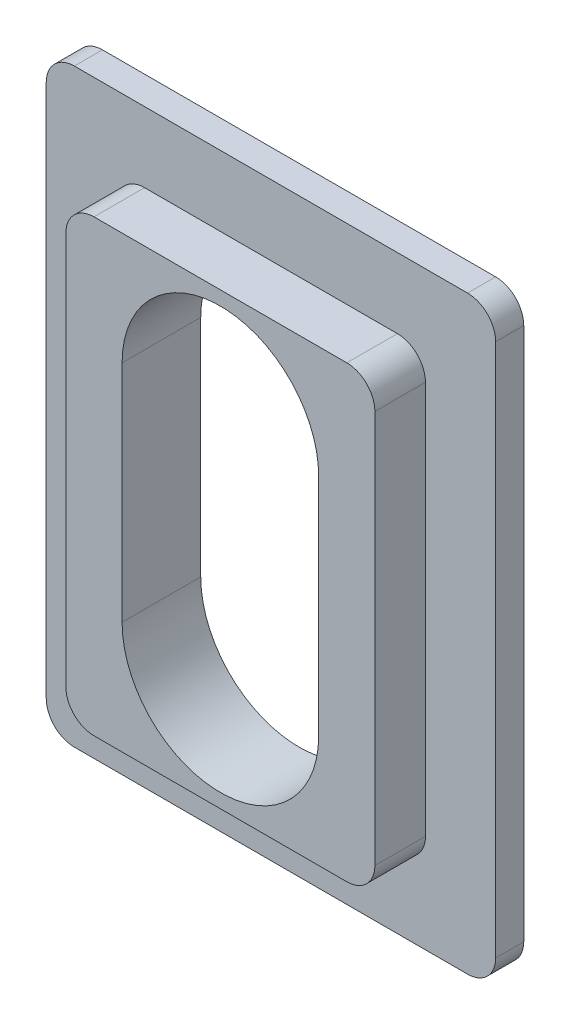
ISO-10303-21;
HEADER;
FILE_DESCRIPTION(('STEP AP214'),'2;1');
FILE_NAME('part.step','',(''),(''),'','','');
FILE_SCHEMA(('AUTOMOTIVE_DESIGN { 1 0 10303 214 1 1 1 1 }'));
ENDSEC;
DATA;
#1=APPLICATION_CONTEXT('core data for automotive mechanical design processes');
#2=APPLICATION_PROTOCOL_DEFINITION('international standard','automotive_design',2000,#1);
#3=PRODUCT_CONTEXT('',#1,'mechanical');
#4=PRODUCT('Part','Part','',(#3));
#5=PRODUCT_RELATED_PRODUCT_CATEGORY('part','',(#4));
#6=PRODUCT_DEFINITION_FORMATION('','',#4);
#7=PRODUCT_DEFINITION_CONTEXT('part definition',#1,'design');
#8=PRODUCT_DEFINITION('design','',#6,#7);
#9=PRODUCT_DEFINITION_SHAPE('','',#8);
#10=(LENGTH_UNIT() NAMED_UNIT(*) SI_UNIT(.MILLI.,.METRE.));
#11=(NAMED_UNIT(*) PLANE_ANGLE_UNIT() SI_UNIT($,.RADIAN.));
#12=(NAMED_UNIT(*) SI_UNIT($,.STERADIAN.) SOLID_ANGLE_UNIT());
#13=UNCERTAINTY_MEASURE_WITH_UNIT(LENGTH_MEASURE(1.E-05),#10,'distance_accuracy_value','');
#14=(GEOMETRIC_REPRESENTATION_CONTEXT(3) GLOBAL_UNCERTAINTY_ASSIGNED_CONTEXT((#13)) GLOBAL_UNIT_ASSIGNED_CONTEXT((#10,
#11,#12)) REPRESENTATION_CONTEXT('',''));
#15=CARTESIAN_POINT('',(0.,0.,0.));
#16=DIRECTION('',(0.,0.,1.));
#17=DIRECTION('',(1.,0.,0.));
#18=AXIS2_PLACEMENT_3D('',#15,#16,#17);
#19=CARTESIAN_POINT('',(1.,1.,1.));
#20=DIRECTION('',(0.,0.,-1.));
#21=DIRECTION('',(-1.,0.,0.));
#22=AXIS2_PLACEMENT_3D('',#19,#20,#21);
#23=CYLINDRICAL_SURFACE('',#22,1.);
#24=CARTESIAN_POINT('',(1.,1.,0.));
#25=DIRECTION('',(0.,0.,1.));
#26=DIRECTION('',(1.,0.,0.));
#27=AXIS2_PLACEMENT_3D('',#24,#25,#26);
#28=CIRCLE('',#27,1.);
#29=CARTESIAN_POINT('',(1.00000000000001,0.,0.));
#30=VERTEX_POINT('',#29);
#31=CARTESIAN_POINT('',(0.,1.00000000000001,0.));
#32=VERTEX_POINT('',#31);
#33=EDGE_CURVE('E297',#30,#32,#28,.F.);
#34=ORIENTED_EDGE('',*,*,#33,.F.);
#35=DIRECTION('',(0.,0.,-1.));
#36=VECTOR('',#35,1.);
#37=CARTESIAN_POINT('',(1.00000000000001,0.,1.));
#38=LINE('',#37,#36);
#39=CARTESIAN_POINT('',(1.00000000000001,0.,1.));
#40=VERTEX_POINT('',#39);
#41=EDGE_CURVE('E11',#40,#30,#38,.T.);
#42=ORIENTED_EDGE('',*,*,#41,.F.);
#43=CARTESIAN_POINT('',(1.,1.,1.));
#44=DIRECTION('',(0.,0.,1.));
#45=DIRECTION('',(1.,0.,0.));
#46=AXIS2_PLACEMENT_3D('',#43,#44,#45);
#47=CIRCLE('',#46,1.);
#48=CARTESIAN_POINT('',(0.,1.00000000000001,1.));
#49=VERTEX_POINT('',#48);
#50=EDGE_CURVE('E263',#40,#49,#47,.F.);
#51=ORIENTED_EDGE('',*,*,#50,.T.);
#52=DIRECTION('',(0.,0.,-1.));
#53=VECTOR('',#52,1.);
#54=CARTESIAN_POINT('',(0.,1.00000000000001,1.));
#55=LINE('',#54,#53);
#56=EDGE_CURVE('E179',#49,#32,#55,.T.);
#57=ORIENTED_EDGE('',*,*,#56,.T.);
#58=EDGE_LOOP('',(#34,#42,#51,#57));
#59=FACE_BOUND('',#58,.T.);
#60=ADVANCED_FACE('F35',(#59),#23,.T.);
#61=CARTESIAN_POINT('',(0.,0.,1.));
#62=DIRECTION('',(0.,1.,0.));
#63=DIRECTION('',(0.,0.,1.));
#64=AXIS2_PLACEMENT_3D('',#61,#62,#63);
#65=PLANE('',#64);
#66=DIRECTION('',(1.,0.,0.));
#67=VECTOR('',#66,1.);
#68=CARTESIAN_POINT('',(0.,0.,0.));
#69=LINE('',#68,#67);
#70=CARTESIAN_POINT('',(15.,0.,0.));
#71=VERTEX_POINT('',#70);
#72=EDGE_CURVE('E300',#30,#71,#69,.T.);
#73=ORIENTED_EDGE('',*,*,#72,.T.);
#74=DIRECTION('',(0.,0.,-1.));
#75=VECTOR('',#74,1.);
#76=CARTESIAN_POINT('',(15.,0.,1.));
#77=LINE('',#76,#75);
#78=CARTESIAN_POINT('',(15.,0.,1.));
#79=VERTEX_POINT('',#78);
#80=EDGE_CURVE('E44',#79,#71,#77,.T.);
#81=ORIENTED_EDGE('',*,*,#80,.F.);
#82=DIRECTION('',(1.,0.,0.));
#83=VECTOR('',#82,1.);
#84=CARTESIAN_POINT('',(0.,0.,1.));
#85=LINE('',#84,#83);
#86=EDGE_CURVE('E266',#40,#79,#85,.T.);
#87=ORIENTED_EDGE('',*,*,#86,.F.);
#88=ORIENTED_EDGE('',*,*,#41,.T.);
#89=EDGE_LOOP('',(#73,#81,#87,#88));
#90=FACE_BOUND('',#89,.T.);
#91=ADVANCED_FACE('F357',(#90),#65,.F.);
#92=CARTESIAN_POINT('',(15.,1.,1.));
#93=DIRECTION('',(0.,0.,-1.));
#94=DIRECTION('',(-1.,0.,0.));
#95=AXIS2_PLACEMENT_3D('',#92,#93,#94);
#96=CYLINDRICAL_SURFACE('',#95,1.);
#97=CARTESIAN_POINT('',(15.,1.,0.));
#98=DIRECTION('',(0.,0.,1.));
#99=DIRECTION('',(1.,0.,0.));
#100=AXIS2_PLACEMENT_3D('',#97,#98,#99);
#101=CIRCLE('',#100,1.);
#102=CARTESIAN_POINT('',(16.,1.,0.));
#103=VERTEX_POINT('',#102);
#104=EDGE_CURVE('E303',#71,#103,#101,.T.);
#105=ORIENTED_EDGE('',*,*,#104,.T.);
#106=DIRECTION('',(0.,0.,-1.));
#107=VECTOR('',#106,1.);
#108=CARTESIAN_POINT('',(16.,1.,1.));
#109=LINE('',#108,#107);
#110=CARTESIAN_POINT('',(16.,1.,1.));
#111=VERTEX_POINT('',#110);
#112=EDGE_CURVE('E329',#111,#103,#109,.T.);
#113=ORIENTED_EDGE('',*,*,#112,.F.);
#114=CARTESIAN_POINT('',(15.,1.,1.));
#115=DIRECTION('',(0.,0.,1.));
#116=DIRECTION('',(1.,0.,0.));
#117=AXIS2_PLACEMENT_3D('',#114,#115,#116);
#118=CIRCLE('',#117,1.);
#119=EDGE_CURVE('E270',#79,#111,#118,.T.);
#120=ORIENTED_EDGE('',*,*,#119,.F.);
#121=ORIENTED_EDGE('',*,*,#80,.T.);
#122=EDGE_LOOP('',(#105,#113,#120,#121));
#123=FACE_BOUND('',#122,.T.);
#124=ADVANCED_FACE('F362',(#123),#96,.T.);
#125=CARTESIAN_POINT('',(16.,0.,1.));
#126=DIRECTION('',(-1.,0.,0.));
#127=DIRECTION('',(0.,0.,1.));
#128=AXIS2_PLACEMENT_3D('',#125,#126,#127);
#129=PLANE('',#128);
#130=DIRECTION('',(0.,1.,0.));
#131=VECTOR('',#130,1.);
#132=CARTESIAN_POINT('',(16.,0.,0.));
#133=LINE('',#132,#131);
#134=CARTESIAN_POINT('',(16.,20.,0.));
#135=VERTEX_POINT('',#134);
#136=EDGE_CURVE('E306',#103,#135,#133,.T.);
#137=ORIENTED_EDGE('',*,*,#136,.T.);
#138=DIRECTION('',(0.,0.,-1.));
#139=VECTOR('',#138,1.);
#140=CARTESIAN_POINT('',(16.,20.,1.));
#141=LINE('',#140,#139);
#142=CARTESIAN_POINT('',(16.,20.,1.));
#143=VERTEX_POINT('',#142);
#144=EDGE_CURVE('E327',#143,#135,#141,.T.);
#145=ORIENTED_EDGE('',*,*,#144,.F.);
#146=DIRECTION('',(0.,1.,0.));
#147=VECTOR('',#146,1.);
#148=CARTESIAN_POINT('',(16.,0.,1.));
#149=LINE('',#148,#147);
#150=EDGE_CURVE('E273',#111,#143,#149,.T.);
#151=ORIENTED_EDGE('',*,*,#150,.F.);
#152=ORIENTED_EDGE('',*,*,#112,.T.);
#153=EDGE_LOOP('',(#137,#145,#151,#152));
#154=FACE_BOUND('',#153,.T.);
#155=ADVANCED_FACE('F369',(#154),#129,.F.);
#156=CARTESIAN_POINT('',(15.,20.,1.));
#157=DIRECTION('',(0.,0.,-1.));
#158=DIRECTION('',(-1.,0.,0.));
#159=AXIS2_PLACEMENT_3D('',#156,#157,#158);
#160=CYLINDRICAL_SURFACE('',#159,1.);
#161=CARTESIAN_POINT('',(15.,20.,0.));
#162=DIRECTION('',(0.,0.,1.));
#163=DIRECTION('',(1.,0.,0.));
#164=AXIS2_PLACEMENT_3D('',#161,#162,#163);
#165=CIRCLE('',#164,1.);
#166=CARTESIAN_POINT('',(15.,21.,0.));
#167=VERTEX_POINT('',#166);
#168=EDGE_CURVE('E309',#167,#135,#165,.F.);
#169=ORIENTED_EDGE('',*,*,#168,.F.);
#170=DIRECTION('',(0.,0.,-1.));
#171=VECTOR('',#170,1.);
#172=CARTESIAN_POINT('',(15.,21.,1.));
#173=LINE('',#172,#171);
#174=CARTESIAN_POINT('',(15.,21.,1.));
#175=VERTEX_POINT('',#174);
#176=EDGE_CURVE('E325',#175,#167,#173,.T.);
#177=ORIENTED_EDGE('',*,*,#176,.F.);
#178=CARTESIAN_POINT('',(15.,20.,1.));
#179=DIRECTION('',(0.,0.,1.));
#180=DIRECTION('',(1.,0.,0.));
#181=AXIS2_PLACEMENT_3D('',#178,#179,#180);
#182=CIRCLE('',#181,1.);
#183=EDGE_CURVE('E275',#175,#143,#182,.F.);
#184=ORIENTED_EDGE('',*,*,#183,.T.);
#185=ORIENTED_EDGE('',*,*,#144,.T.);
#186=EDGE_LOOP('',(#169,#177,#184,#185));
#187=FACE_BOUND('',#186,.T.);
#188=ADVANCED_FACE('F373',(#187),#160,.T.);
#189=CARTESIAN_POINT('',(0.,21.,1.));
#190=DIRECTION('',(0.,1.,0.));
#191=DIRECTION('',(0.,0.,1.));
#192=AXIS2_PLACEMENT_3D('',#189,#190,#191);
#193=PLANE('',#192);
#194=DIRECTION('',(1.,0.,0.));
#195=VECTOR('',#194,1.);
#196=CARTESIAN_POINT('',(0.,21.,0.));
#197=LINE('',#196,#195);
#198=CARTESIAN_POINT('',(1.,21.,0.));
#199=VERTEX_POINT('',#198);
#200=EDGE_CURVE('E312',#199,#167,#197,.T.);
#201=ORIENTED_EDGE('',*,*,#200,.F.);
#202=DIRECTION('',(0.,0.,-1.));
#203=VECTOR('',#202,1.);
#204=CARTESIAN_POINT('',(1.,21.,1.));
#205=LINE('',#204,#203);
#206=CARTESIAN_POINT('',(1.,21.,1.));
#207=VERTEX_POINT('',#206);
#208=EDGE_CURVE('E323',#207,#199,#205,.T.);
#209=ORIENTED_EDGE('',*,*,#208,.F.);
#210=DIRECTION('',(1.,0.,0.));
#211=VECTOR('',#210,1.);
#212=CARTESIAN_POINT('',(0.,21.,1.));
#213=LINE('',#212,#211);
#214=EDGE_CURVE('E278',#207,#175,#213,.T.);
#215=ORIENTED_EDGE('',*,*,#214,.T.);
#216=ORIENTED_EDGE('',*,*,#176,.T.);
#217=EDGE_LOOP('',(#201,#209,#215,#216));
#218=FACE_BOUND('',#217,.T.);
#219=ADVANCED_FACE('F377',(#218),#193,.T.);
#220=CARTESIAN_POINT('',(1.,20.,1.));
#221=DIRECTION('',(0.,0.,-1.));
#222=DIRECTION('',(-1.,0.,0.));
#223=AXIS2_PLACEMENT_3D('',#220,#221,#222);
#224=CYLINDRICAL_SURFACE('',#223,1.);
#225=CARTESIAN_POINT('',(1.,20.,0.));
#226=DIRECTION('',(0.,0.,1.));
#227=DIRECTION('',(1.,0.,0.));
#228=AXIS2_PLACEMENT_3D('',#225,#226,#227);
#229=CIRCLE('',#228,1.);
#230=CARTESIAN_POINT('',(0.,20.,0.));
#231=VERTEX_POINT('',#230);
#232=EDGE_CURVE('E315',#231,#199,#229,.F.);
#233=ORIENTED_EDGE('',*,*,#232,.F.);
#234=DIRECTION('',(0.,0.,-1.));
#235=VECTOR('',#234,1.);
#236=CARTESIAN_POINT('',(0.,20.,1.));
#237=LINE('',#236,#235);
#238=CARTESIAN_POINT('',(0.,20.,1.));
#239=VERTEX_POINT('',#238);
#240=EDGE_CURVE('E321',#239,#231,#237,.T.);
#241=ORIENTED_EDGE('',*,*,#240,.F.);
#242=CARTESIAN_POINT('',(1.,20.,1.));
#243=DIRECTION('',(0.,0.,1.));
#244=DIRECTION('',(1.,0.,0.));
#245=AXIS2_PLACEMENT_3D('',#242,#243,#244);
#246=CIRCLE('',#245,1.);
#247=EDGE_CURVE('E281',#239,#207,#246,.F.);
#248=ORIENTED_EDGE('',*,*,#247,.T.);
#249=ORIENTED_EDGE('',*,*,#208,.T.);
#250=EDGE_LOOP('',(#233,#241,#248,#249));
#251=FACE_BOUND('',#250,.T.);
#252=ADVANCED_FACE('F381',(#251),#224,.T.);
#253=CARTESIAN_POINT('',(8.,14.5,1.));
#254=DIRECTION('',(0.,0.,-1.));
#255=DIRECTION('',(-1.,0.,0.));
#256=AXIS2_PLACEMENT_3D('',#253,#254,#255);
#257=CYLINDRICAL_SURFACE('',#256,3.5);
#258=CARTESIAN_POINT('',(8.,14.5,0.));
#259=DIRECTION('',(0.,0.,1.));
#260=DIRECTION('',(1.,0.,0.));
#261=AXIS2_PLACEMENT_3D('',#258,#259,#260);
#262=CIRCLE('',#261,3.5);
#263=CARTESIAN_POINT('',(11.5,14.5,0.));
#264=VERTEX_POINT('',#263);
#265=CARTESIAN_POINT('',(4.5,14.5,0.));
#266=VERTEX_POINT('',#265);
#267=EDGE_CURVE('E174',#264,#266,#262,.T.);
#268=ORIENTED_EDGE('',*,*,#267,.F.);
#269=DIRECTION('',(0.,0.,-1.));
#270=VECTOR('',#269,1.);
#271=CARTESIAN_POINT('',(11.5,14.5,1.));
#272=LINE('',#271,#270);
#273=CARTESIAN_POINT('',(11.5,14.5,2.8));
#274=VERTEX_POINT('',#273);
#275=EDGE_CURVE('E39',#274,#264,#272,.T.);
#276=ORIENTED_EDGE('',*,*,#275,.F.);
#277=CARTESIAN_POINT('',(8.,14.5,2.8));
#278=DIRECTION('',(0.,0.,1.));
#279=DIRECTION('',(1.,0.,0.));
#280=AXIS2_PLACEMENT_3D('',#277,#278,#279);
#281=CIRCLE('',#280,3.5);
#282=CARTESIAN_POINT('',(4.5,14.5,2.8));
#283=VERTEX_POINT('',#282);
#284=EDGE_CURVE('E172',#274,#283,#281,.T.);
#285=ORIENTED_EDGE('',*,*,#284,.T.);
#286=DIRECTION('',(0.,0.,-1.));
#287=VECTOR('',#286,1.);
#288=CARTESIAN_POINT('',(4.5,14.5,1.));
#289=LINE('',#288,#287);
#290=EDGE_CURVE('E287',#283,#266,#289,.T.);
#291=ORIENTED_EDGE('',*,*,#290,.T.);
#292=EDGE_LOOP('',(#268,#276,#285,#291));
#293=FACE_BOUND('',#292,.T.);
#294=ADVANCED_FACE('F37',(#293),#257,.F.);
#295=CARTESIAN_POINT('',(11.5,0.,1.));
#296=DIRECTION('',(-1.,0.,0.));
#297=DIRECTION('',(0.,-1.,0.));
#298=AXIS2_PLACEMENT_3D('',#295,#296,#297);
#299=PLANE('',#298);
#300=DIRECTION('',(0.,1.,0.));
#301=VECTOR('',#300,1.);
#302=CARTESIAN_POINT('',(11.5,0.,0.));
#303=LINE('',#302,#301);
#304=CARTESIAN_POINT('',(11.5,6.5,0.));
#305=VERTEX_POINT('',#304);
#306=EDGE_CURVE('E289',#305,#264,#303,.T.);
#307=ORIENTED_EDGE('',*,*,#306,.F.);
#308=DIRECTION('',(0.,0.,-1.));
#309=VECTOR('',#308,1.);
#310=CARTESIAN_POINT('',(11.5,6.5,1.));
#311=LINE('',#310,#309);
#312=CARTESIAN_POINT('',(11.5,6.5,2.8));
#313=VERTEX_POINT('',#312);
#314=EDGE_CURVE('E180',#313,#305,#311,.T.);
#315=ORIENTED_EDGE('',*,*,#314,.F.);
#316=DIRECTION('',(0.,1.,0.));
#317=VECTOR('',#316,1.);
#318=CARTESIAN_POINT('',(11.5,0.,2.8));
#319=LINE('',#318,#317);
#320=EDGE_CURVE('E187',#313,#274,#319,.T.);
#321=ORIENTED_EDGE('',*,*,#320,.T.);
#322=ORIENTED_EDGE('',*,*,#275,.T.);
#323=EDGE_LOOP('',(#307,#315,#321,#322));
#324=FACE_BOUND('',#323,.T.);
#325=ADVANCED_FACE('F192',(#324),#299,.T.);
#326=CARTESIAN_POINT('',(8.,6.5,1.));
#327=DIRECTION('',(0.,0.,-1.));
#328=DIRECTION('',(-1.,0.,0.));
#329=AXIS2_PLACEMENT_3D('',#326,#327,#328);
#330=CYLINDRICAL_SURFACE('',#329,3.5);
#331=CARTESIAN_POINT('',(8.,6.5,0.));
#332=DIRECTION('',(0.,0.,1.));
#333=DIRECTION('',(1.,0.,0.));
#334=AXIS2_PLACEMENT_3D('',#331,#332,#333);
#335=CIRCLE('',#334,3.5);
#336=CARTESIAN_POINT('',(4.5,6.5,0.));
#337=VERTEX_POINT('',#336);
#338=EDGE_CURVE('E291',#337,#305,#335,.T.);
#339=ORIENTED_EDGE('',*,*,#338,.F.);
#340=DIRECTION('',(0.,0.,-1.));
#341=VECTOR('',#340,1.);
#342=CARTESIAN_POINT('',(4.5,6.5,1.));
#343=LINE('',#342,#341);
#344=CARTESIAN_POINT('',(4.5,6.5,2.8));
#345=VERTEX_POINT('',#344);
#346=EDGE_CURVE('E335',#345,#337,#343,.T.);
#347=ORIENTED_EDGE('',*,*,#346,.F.);
#348=CARTESIAN_POINT('',(8.,6.5,2.8));
#349=DIRECTION('',(0.,0.,1.));
#350=DIRECTION('',(1.,0.,0.));
#351=AXIS2_PLACEMENT_3D('',#348,#349,#350);
#352=CIRCLE('',#351,3.5);
#353=EDGE_CURVE('E193',#345,#313,#352,.T.);
#354=ORIENTED_EDGE('',*,*,#353,.T.);
#355=ORIENTED_EDGE('',*,*,#314,.T.);
#356=EDGE_LOOP('',(#339,#347,#354,#355));
#357=FACE_BOUND('',#356,.T.);
#358=ADVANCED_FACE('F338',(#357),#330,.F.);
#359=CARTESIAN_POINT('',(4.5,0.,1.));
#360=DIRECTION('',(-1.,0.,0.));
#361=DIRECTION('',(0.,-1.,0.));
#362=AXIS2_PLACEMENT_3D('',#359,#360,#361);
#363=PLANE('',#362);
#364=DIRECTION('',(0.,1.,0.));
#365=VECTOR('',#364,1.);
#366=CARTESIAN_POINT('',(4.5,0.,0.));
#367=LINE('',#366,#365);
#368=EDGE_CURVE('E294',#337,#266,#367,.T.);
#369=ORIENTED_EDGE('',*,*,#368,.T.);
#370=ORIENTED_EDGE('',*,*,#290,.F.);
#371=DIRECTION('',(0.,1.,0.));
#372=VECTOR('',#371,1.);
#373=CARTESIAN_POINT('',(4.5,0.,2.8));
#374=LINE('',#373,#372);
#375=EDGE_CURVE('E190',#345,#283,#374,.T.);
#376=ORIENTED_EDGE('',*,*,#375,.F.);
#377=ORIENTED_EDGE('',*,*,#346,.T.);
#378=EDGE_LOOP('',(#369,#370,#376,#377));
#379=FACE_BOUND('',#378,.T.);
#380=ADVANCED_FACE('F343',(#379),#363,.F.);
#381=CARTESIAN_POINT('',(0.,0.,1.));
#382=DIRECTION('',(-1.,0.,0.));
#383=DIRECTION('',(0.,0.,1.));
#384=AXIS2_PLACEMENT_3D('',#381,#382,#383);
#385=PLANE('',#384);
#386=DIRECTION('',(0.,1.,0.));
#387=VECTOR('',#386,1.);
#388=CARTESIAN_POINT('',(0.,0.,0.));
#389=LINE('',#388,#387);
#390=EDGE_CURVE('E267',#32,#231,#389,.T.);
#391=ORIENTED_EDGE('',*,*,#390,.F.);
#392=ORIENTED_EDGE('',*,*,#56,.F.);
#393=DIRECTION('',(0.,1.,0.));
#394=VECTOR('',#393,1.);
#395=CARTESIAN_POINT('',(0.,0.,1.));
#396=LINE('',#395,#394);
#397=EDGE_CURVE('E284',#49,#239,#396,.T.);
#398=ORIENTED_EDGE('',*,*,#397,.T.);
#399=ORIENTED_EDGE('',*,*,#240,.T.);
#400=EDGE_LOOP('',(#391,#392,#398,#399));
#401=FACE_BOUND('',#400,.T.);
#402=ADVANCED_FACE('F345',(#401),#385,.T.);
#403=CARTESIAN_POINT('',(0.,0.,1.));
#404=DIRECTION('',(0.,0.,1.));
#405=DIRECTION('',(1.,0.,0.));
#406=AXIS2_PLACEMENT_3D('',#403,#404,#405);
#407=PLANE('',#406);
#408=CARTESIAN_POINT('',(3.5,3.5,1.));
#409=DIRECTION('',(0.,0.,1.));
#410=DIRECTION('',(1.,0.,0.));
#411=AXIS2_PLACEMENT_3D('',#408,#409,#410);
#412=CIRCLE('',#411,1.);
#413=CARTESIAN_POINT('',(2.5,3.50000000000001,1.));
#414=VERTEX_POINT('',#413);
#415=CARTESIAN_POINT('',(3.50000000000001,2.5,1.));
#416=VERTEX_POINT('',#415);
#417=EDGE_CURVE('E261',#414,#416,#412,.T.);
#418=ORIENTED_EDGE('',*,*,#417,.F.);
#419=DIRECTION('',(0.,-1.,0.));
#420=VECTOR('',#419,1.);
#421=CARTESIAN_POINT('',(2.5,0.,1.));
#422=LINE('',#421,#420);
#423=CARTESIAN_POINT('',(2.5,17.5,1.));
#424=VERTEX_POINT('',#423);
#425=EDGE_CURVE('E245',#424,#414,#422,.T.);
#426=ORIENTED_EDGE('',*,*,#425,.F.);
#427=CARTESIAN_POINT('',(3.5,17.5,1.));
#428=DIRECTION('',(0.,0.,1.));
#429=DIRECTION('',(1.,0.,0.));
#430=AXIS2_PLACEMENT_3D('',#427,#428,#429);
#431=CIRCLE('',#430,0.999999999999999);
#432=CARTESIAN_POINT('',(3.5,18.5,1.));
#433=VERTEX_POINT('',#432);
#434=EDGE_CURVE('E248',#433,#424,#431,.T.);
#435=ORIENTED_EDGE('',*,*,#434,.F.);
#436=DIRECTION('',(-1.,0.,0.));
#437=VECTOR('',#436,1.);
#438=CARTESIAN_POINT('',(0.,18.5,1.));
#439=LINE('',#438,#437);
#440=CARTESIAN_POINT('',(12.5,18.5,1.));
#441=VERTEX_POINT('',#440);
#442=EDGE_CURVE('E251',#441,#433,#439,.T.);
#443=ORIENTED_EDGE('',*,*,#442,.F.);
#444=CARTESIAN_POINT('',(12.5,17.5,1.));
#445=DIRECTION('',(0.,0.,1.));
#446=DIRECTION('',(1.,0.,0.));
#447=AXIS2_PLACEMENT_3D('',#444,#445,#446);
#448=CIRCLE('',#447,0.999999999999999);
#449=CARTESIAN_POINT('',(13.5,17.5,1.));
#450=VERTEX_POINT('',#449);
#451=EDGE_CURVE('E254',#450,#441,#448,.T.);
#452=ORIENTED_EDGE('',*,*,#451,.F.);
#453=DIRECTION('',(0.,-1.,0.));
#454=VECTOR('',#453,1.);
#455=CARTESIAN_POINT('',(13.5,0.,1.));
#456=LINE('',#455,#454);
#457=CARTESIAN_POINT('',(13.5,3.5,1.));
#458=VERTEX_POINT('',#457);
#459=EDGE_CURVE('E257',#450,#458,#456,.T.);
#460=ORIENTED_EDGE('',*,*,#459,.T.);
#461=CARTESIAN_POINT('',(12.5,3.5,1.));
#462=DIRECTION('',(0.,0.,1.));
#463=DIRECTION('',(1.,0.,0.));
#464=AXIS2_PLACEMENT_3D('',#461,#462,#463);
#465=CIRCLE('',#464,1.);
#466=CARTESIAN_POINT('',(12.5,2.5,1.));
#467=VERTEX_POINT('',#466);
#468=EDGE_CURVE('E57',#458,#467,#465,.F.);
#469=ORIENTED_EDGE('',*,*,#468,.T.);
#470=DIRECTION('',(-1.,0.,0.));
#471=VECTOR('',#470,1.);
#472=CARTESIAN_POINT('',(0.,2.5,1.));
#473=LINE('',#472,#471);
#474=EDGE_CURVE('E52',#467,#416,#473,.T.);
#475=ORIENTED_EDGE('',*,*,#474,.T.);
#476=EDGE_LOOP('',(#418,#426,#435,#443,#452,#460,#469,#475));
#477=FACE_BOUND('',#476,.T.);
#478=ORIENTED_EDGE('',*,*,#50,.F.);
#479=ORIENTED_EDGE('',*,*,#86,.T.);
#480=ORIENTED_EDGE('',*,*,#119,.T.);
#481=ORIENTED_EDGE('',*,*,#150,.T.);
#482=ORIENTED_EDGE('',*,*,#183,.F.);
#483=ORIENTED_EDGE('',*,*,#214,.F.);
#484=ORIENTED_EDGE('',*,*,#247,.F.);
#485=ORIENTED_EDGE('',*,*,#397,.F.);
#486=EDGE_LOOP('',(#478,#479,#480,#481,#482,#483,#484,#485));
#487=FACE_BOUND('',#486,.T.);
#488=ADVANCED_FACE('F351',(#477,#487),#407,.T.);
#489=CARTESIAN_POINT('',(0.,0.,0.));
#490=DIRECTION('',(0.,0.,1.));
#491=DIRECTION('',(1.,0.,0.));
#492=AXIS2_PLACEMENT_3D('',#489,#490,#491);
#493=PLANE('',#492);
#494=ORIENTED_EDGE('',*,*,#33,.T.);
#495=ORIENTED_EDGE('',*,*,#390,.T.);
#496=ORIENTED_EDGE('',*,*,#232,.T.);
#497=ORIENTED_EDGE('',*,*,#200,.T.);
#498=ORIENTED_EDGE('',*,*,#168,.T.);
#499=ORIENTED_EDGE('',*,*,#136,.F.);
#500=ORIENTED_EDGE('',*,*,#104,.F.);
#501=ORIENTED_EDGE('',*,*,#72,.F.);
#502=EDGE_LOOP('',(#494,#495,#496,#497,#498,#499,#500,#501));
#503=FACE_BOUND('',#502,.T.);
#504=ORIENTED_EDGE('',*,*,#267,.T.);
#505=ORIENTED_EDGE('',*,*,#368,.F.);
#506=ORIENTED_EDGE('',*,*,#338,.T.);
#507=ORIENTED_EDGE('',*,*,#306,.T.);
#508=EDGE_LOOP('',(#504,#505,#506,#507));
#509=FACE_BOUND('',#508,.T.);
#510=ADVANCED_FACE('F341',(#503,#509),#493,.F.);
#511=CARTESIAN_POINT('',(3.5,3.5,2.8));
#512=DIRECTION('',(0.,0.,-1.));
#513=DIRECTION('',(-1.,0.,0.));
#514=AXIS2_PLACEMENT_3D('',#511,#512,#513);
#515=CYLINDRICAL_SURFACE('',#514,1.);
#516=DIRECTION('',(0.,0.,-1.));
#517=VECTOR('',#516,1.);
#518=CARTESIAN_POINT('',(2.5,3.50000000000001,2.8));
#519=LINE('',#518,#517);
#520=CARTESIAN_POINT('',(2.5,3.50000000000001,2.8));
#521=VERTEX_POINT('',#520);
#522=EDGE_CURVE('E221',#521,#414,#519,.T.);
#523=ORIENTED_EDGE('',*,*,#522,.T.);
#524=ORIENTED_EDGE('',*,*,#417,.T.);
#525=DIRECTION('',(0.,0.,-1.));
#526=VECTOR('',#525,1.);
#527=CARTESIAN_POINT('',(3.50000000000001,2.5,2.8));
#528=LINE('',#527,#526);
#529=CARTESIAN_POINT('',(3.50000000000001,2.5,2.8));
#530=VERTEX_POINT('',#529);
#531=EDGE_CURVE('E242',#530,#416,#528,.T.);
#532=ORIENTED_EDGE('',*,*,#531,.F.);
#533=CARTESIAN_POINT('',(3.5,3.5,2.8));
#534=DIRECTION('',(0.,0.,1.));
#535=DIRECTION('',(1.,0.,0.));
#536=AXIS2_PLACEMENT_3D('',#533,#534,#535);
#537=CIRCLE('',#536,1.);
#538=EDGE_CURVE('E198',#530,#521,#537,.F.);
#539=ORIENTED_EDGE('',*,*,#538,.T.);
#540=EDGE_LOOP('',(#523,#524,#532,#539));
#541=FACE_BOUND('',#540,.T.);
#542=ADVANCED_FACE('F388',(#541),#515,.T.);
#543=CARTESIAN_POINT('',(0.,2.5,2.8));
#544=DIRECTION('',(0.,1.,0.));
#545=DIRECTION('',(0.,0.,1.));
#546=AXIS2_PLACEMENT_3D('',#543,#544,#545);
#547=PLANE('',#546);
#548=ORIENTED_EDGE('',*,*,#474,.F.);
#549=DIRECTION('',(0.,0.,-1.));
#550=VECTOR('',#549,1.);
#551=CARTESIAN_POINT('',(12.5,2.5,2.8));
#552=LINE('',#551,#550);
#553=CARTESIAN_POINT('',(12.5,2.5,2.8));
#554=VERTEX_POINT('',#553);
#555=EDGE_CURVE('E239',#554,#467,#552,.T.);
#556=ORIENTED_EDGE('',*,*,#555,.F.);
#557=DIRECTION('',(1.,0.,0.));
#558=VECTOR('',#557,1.);
#559=CARTESIAN_POINT('',(0.,2.5,2.8));
#560=LINE('',#559,#558);
#561=EDGE_CURVE('E201',#530,#554,#560,.T.);
#562=ORIENTED_EDGE('',*,*,#561,.F.);
#563=ORIENTED_EDGE('',*,*,#531,.T.);
#564=EDGE_LOOP('',(#548,#556,#562,#563));
#565=FACE_BOUND('',#564,.T.);
#566=ADVANCED_FACE('F394',(#565),#547,.F.);
#567=CARTESIAN_POINT('',(12.5,3.5,2.8));
#568=DIRECTION('',(0.,0.,-1.));
#569=DIRECTION('',(-1.,0.,0.));
#570=AXIS2_PLACEMENT_3D('',#567,#568,#569);
#571=CYLINDRICAL_SURFACE('',#570,1.);
#572=ORIENTED_EDGE('',*,*,#468,.F.);
#573=DIRECTION('',(0.,0.,-1.));
#574=VECTOR('',#573,1.);
#575=CARTESIAN_POINT('',(13.5,3.5,2.8));
#576=LINE('',#575,#574);
#577=CARTESIAN_POINT('',(13.5,3.5,2.8));
#578=VERTEX_POINT('',#577);
#579=EDGE_CURVE('E236',#578,#458,#576,.T.);
#580=ORIENTED_EDGE('',*,*,#579,.F.);
#581=CARTESIAN_POINT('',(12.5,3.5,2.8));
#582=DIRECTION('',(0.,0.,1.));
#583=DIRECTION('',(1.,0.,0.));
#584=AXIS2_PLACEMENT_3D('',#581,#582,#583);
#585=CIRCLE('',#584,1.);
#586=EDGE_CURVE('E204',#554,#578,#585,.T.);
#587=ORIENTED_EDGE('',*,*,#586,.F.);
#588=ORIENTED_EDGE('',*,*,#555,.T.);
#589=EDGE_LOOP('',(#572,#580,#587,#588));
#590=FACE_BOUND('',#589,.T.);
#591=ADVANCED_FACE('F398',(#590),#571,.T.);
#592=CARTESIAN_POINT('',(13.5,0.,2.8));
#593=DIRECTION('',(-1.,0.,0.));
#594=DIRECTION('',(0.,-1.,0.));
#595=AXIS2_PLACEMENT_3D('',#592,#593,#594);
#596=PLANE('',#595);
#597=ORIENTED_EDGE('',*,*,#459,.F.);
#598=DIRECTION('',(0.,0.,-1.));
#599=VECTOR('',#598,1.);
#600=CARTESIAN_POINT('',(13.5,17.5,2.8));
#601=LINE('',#600,#599);
#602=CARTESIAN_POINT('',(13.5,17.5,2.8));
#603=VERTEX_POINT('',#602);
#604=EDGE_CURVE('E233',#603,#450,#601,.T.);
#605=ORIENTED_EDGE('',*,*,#604,.F.);
#606=DIRECTION('',(0.,1.,0.));
#607=VECTOR('',#606,1.);
#608=CARTESIAN_POINT('',(13.5,0.,2.8));
#609=LINE('',#608,#607);
#610=EDGE_CURVE('E207',#578,#603,#609,.T.);
#611=ORIENTED_EDGE('',*,*,#610,.F.);
#612=ORIENTED_EDGE('',*,*,#579,.T.);
#613=EDGE_LOOP('',(#597,#605,#611,#612));
#614=FACE_BOUND('',#613,.T.);
#615=ADVANCED_FACE('F402',(#614),#596,.F.);
#616=CARTESIAN_POINT('',(12.5,17.5,2.8));
#617=DIRECTION('',(0.,0.,-1.));
#618=DIRECTION('',(-1.,0.,0.));
#619=AXIS2_PLACEMENT_3D('',#616,#617,#618);
#620=CYLINDRICAL_SURFACE('',#619,0.999999999999999);
#621=ORIENTED_EDGE('',*,*,#604,.T.);
#622=ORIENTED_EDGE('',*,*,#451,.T.);
#623=DIRECTION('',(0.,0.,-1.));
#624=VECTOR('',#623,1.);
#625=CARTESIAN_POINT('',(12.5,18.5,2.8));
#626=LINE('',#625,#624);
#627=CARTESIAN_POINT('',(12.5,18.5,2.8));
#628=VERTEX_POINT('',#627);
#629=EDGE_CURVE('E230',#628,#441,#626,.T.);
#630=ORIENTED_EDGE('',*,*,#629,.F.);
#631=CARTESIAN_POINT('',(12.5,17.5,2.8));
#632=DIRECTION('',(0.,0.,1.));
#633=DIRECTION('',(1.,0.,0.));
#634=AXIS2_PLACEMENT_3D('',#631,#632,#633);
#635=CIRCLE('',#634,0.999999999999999);
#636=EDGE_CURVE('E209',#628,#603,#635,.F.);
#637=ORIENTED_EDGE('',*,*,#636,.T.);
#638=EDGE_LOOP('',(#621,#622,#630,#637));
#639=FACE_BOUND('',#638,.T.);
#640=ADVANCED_FACE('F406',(#639),#620,.T.);
#641=CARTESIAN_POINT('',(0.,18.5,2.8));
#642=DIRECTION('',(0.,1.,0.));
#643=DIRECTION('',(0.,0.,1.));
#644=AXIS2_PLACEMENT_3D('',#641,#642,#643);
#645=PLANE('',#644);
#646=ORIENTED_EDGE('',*,*,#629,.T.);
#647=ORIENTED_EDGE('',*,*,#442,.T.);
#648=DIRECTION('',(0.,0.,-1.));
#649=VECTOR('',#648,1.);
#650=CARTESIAN_POINT('',(3.5,18.5,2.8));
#651=LINE('',#650,#649);
#652=CARTESIAN_POINT('',(3.5,18.5,2.8));
#653=VERTEX_POINT('',#652);
#654=EDGE_CURVE('E227',#653,#433,#651,.T.);
#655=ORIENTED_EDGE('',*,*,#654,.F.);
#656=DIRECTION('',(1.,0.,0.));
#657=VECTOR('',#656,1.);
#658=CARTESIAN_POINT('',(0.,18.5,2.8));
#659=LINE('',#658,#657);
#660=EDGE_CURVE('E212',#653,#628,#659,.T.);
#661=ORIENTED_EDGE('',*,*,#660,.T.);
#662=EDGE_LOOP('',(#646,#647,#655,#661));
#663=FACE_BOUND('',#662,.T.);
#664=ADVANCED_FACE('F410',(#663),#645,.T.);
#665=CARTESIAN_POINT('',(3.5,17.5,2.8));
#666=DIRECTION('',(0.,0.,-1.));
#667=DIRECTION('',(-1.,0.,0.));
#668=AXIS2_PLACEMENT_3D('',#665,#666,#667);
#669=CYLINDRICAL_SURFACE('',#668,0.999999999999999);
#670=ORIENTED_EDGE('',*,*,#654,.T.);
#671=ORIENTED_EDGE('',*,*,#434,.T.);
#672=DIRECTION('',(0.,0.,-1.));
#673=VECTOR('',#672,1.);
#674=CARTESIAN_POINT('',(2.5,17.5,2.8));
#675=LINE('',#674,#673);
#676=CARTESIAN_POINT('',(2.5,17.5,2.8));
#677=VERTEX_POINT('',#676);
#678=EDGE_CURVE('E224',#677,#424,#675,.T.);
#679=ORIENTED_EDGE('',*,*,#678,.F.);
#680=CARTESIAN_POINT('',(3.5,17.5,2.8));
#681=DIRECTION('',(0.,0.,1.));
#682=DIRECTION('',(1.,0.,0.));
#683=AXIS2_PLACEMENT_3D('',#680,#681,#682);
#684=CIRCLE('',#683,0.999999999999999);
#685=EDGE_CURVE('E215',#677,#653,#684,.F.);
#686=ORIENTED_EDGE('',*,*,#685,.T.);
#687=EDGE_LOOP('',(#670,#671,#679,#686));
#688=FACE_BOUND('',#687,.T.);
#689=ADVANCED_FACE('F414',(#688),#669,.T.);
#690=CARTESIAN_POINT('',(2.5,0.,2.8));
#691=DIRECTION('',(-1.,0.,0.));
#692=DIRECTION('',(0.,-1.,0.));
#693=AXIS2_PLACEMENT_3D('',#690,#691,#692);
#694=PLANE('',#693);
#695=ORIENTED_EDGE('',*,*,#678,.T.);
#696=ORIENTED_EDGE('',*,*,#425,.T.);
#697=ORIENTED_EDGE('',*,*,#522,.F.);
#698=DIRECTION('',(0.,1.,0.));
#699=VECTOR('',#698,1.);
#700=CARTESIAN_POINT('',(2.5,0.,2.8));
#701=LINE('',#700,#699);
#702=EDGE_CURVE('E218',#521,#677,#701,.T.);
#703=ORIENTED_EDGE('',*,*,#702,.T.);
#704=EDGE_LOOP('',(#695,#696,#697,#703));
#705=FACE_BOUND('',#704,.T.);
#706=ADVANCED_FACE('F418',(#705),#694,.T.);
#707=CARTESIAN_POINT('',(0.,0.,2.8));
#708=DIRECTION('',(0.,0.,1.));
#709=DIRECTION('',(1.,0.,0.));
#710=AXIS2_PLACEMENT_3D('',#707,#708,#709);
#711=PLANE('',#710);
#712=ORIENTED_EDGE('',*,*,#284,.F.);
#713=ORIENTED_EDGE('',*,*,#320,.F.);
#714=ORIENTED_EDGE('',*,*,#353,.F.);
#715=ORIENTED_EDGE('',*,*,#375,.T.);
#716=EDGE_LOOP('',(#712,#713,#714,#715));
#717=FACE_BOUND('',#716,.T.);
#718=ORIENTED_EDGE('',*,*,#538,.F.);
#719=ORIENTED_EDGE('',*,*,#561,.T.);
#720=ORIENTED_EDGE('',*,*,#586,.T.);
#721=ORIENTED_EDGE('',*,*,#610,.T.);
#722=ORIENTED_EDGE('',*,*,#636,.F.);
#723=ORIENTED_EDGE('',*,*,#660,.F.);
#724=ORIENTED_EDGE('',*,*,#685,.F.);
#725=ORIENTED_EDGE('',*,*,#702,.F.);
#726=EDGE_LOOP('',(#718,#719,#720,#721,#722,#723,#724,#725));
#727=FACE_BOUND('',#726,.T.);
#728=ADVANCED_FACE('F184',(#717,#727),#711,.T.);
#729=CLOSED_SHELL('',(#60,#91,#124,#155,#188,#219,#252,#294,#325,#358,#380,#402,#488,#510,#542,
#566,#591,#615,#640,#664,#689,#706,#728));
#730=MANIFOLD_SOLID_BREP('B2',#729);
#731=ADVANCED_BREP_SHAPE_REPRESENTATION('',(#18,#730),#14);
#732=SHAPE_DEFINITION_REPRESENTATION(#9,#731);
ENDSEC;
END-ISO-10303-21;
